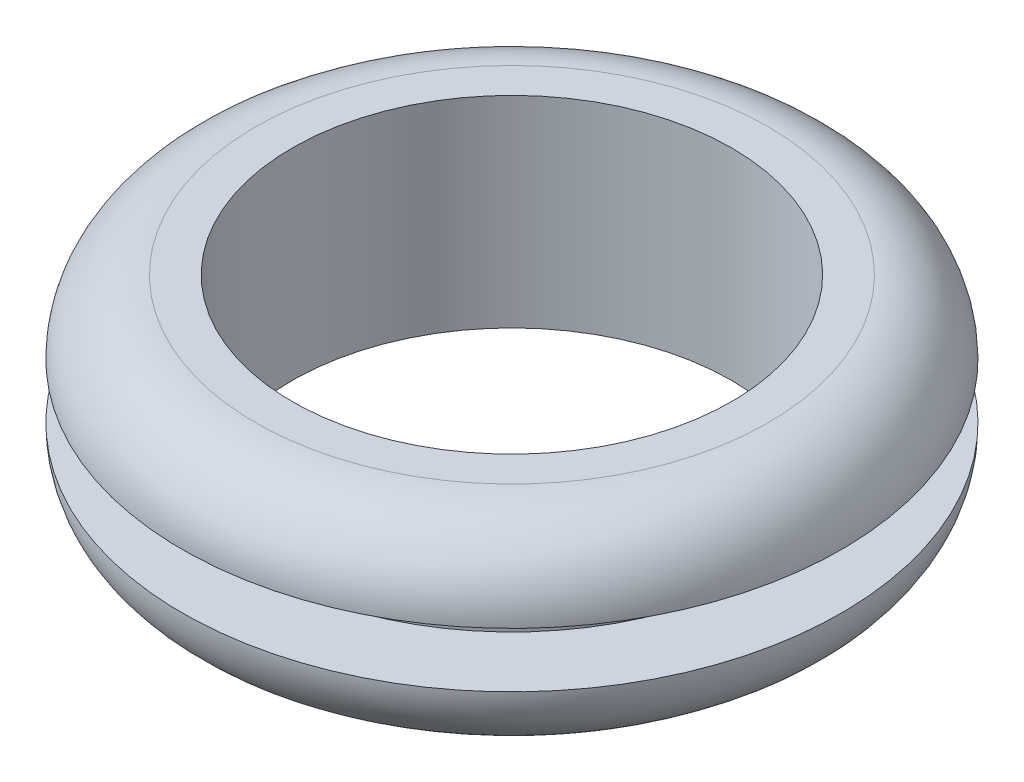
ISO-10303-21;
HEADER;
FILE_DESCRIPTION(('STEP AP214'),'2;1');
FILE_NAME('part.step','',(''),(''),'','','');
FILE_SCHEMA(('AUTOMOTIVE_DESIGN { 1 0 10303 214 1 1 1 1 }'));
ENDSEC;
DATA;
#1=APPLICATION_CONTEXT('core data for automotive mechanical design processes');
#2=APPLICATION_PROTOCOL_DEFINITION('international standard','automotive_design',2000,#1);
#3=PRODUCT_CONTEXT('',#1,'mechanical');
#4=PRODUCT('Part','Part','',(#3));
#5=PRODUCT_RELATED_PRODUCT_CATEGORY('part','',(#4));
#6=PRODUCT_DEFINITION_FORMATION('','',#4);
#7=PRODUCT_DEFINITION_CONTEXT('part definition',#1,'design');
#8=PRODUCT_DEFINITION('design','',#6,#7);
#9=PRODUCT_DEFINITION_SHAPE('','',#8);
#10=(LENGTH_UNIT() NAMED_UNIT(*) SI_UNIT(.MILLI.,.METRE.));
#11=(NAMED_UNIT(*) PLANE_ANGLE_UNIT() SI_UNIT($,.RADIAN.));
#12=(NAMED_UNIT(*) SI_UNIT($,.STERADIAN.) SOLID_ANGLE_UNIT());
#13=UNCERTAINTY_MEASURE_WITH_UNIT(LENGTH_MEASURE(1.E-05),#10,'distance_accuracy_value','');
#14=(GEOMETRIC_REPRESENTATION_CONTEXT(3) GLOBAL_UNCERTAINTY_ASSIGNED_CONTEXT((#13)) GLOBAL_UNIT_ASSIGNED_CONTEXT((#10,
#11,#12)) REPRESENTATION_CONTEXT('',''));
#15=CARTESIAN_POINT('',(0.,0.,0.));
#16=DIRECTION('',(0.,0.,1.));
#17=DIRECTION('',(1.,0.,0.));
#18=AXIS2_PLACEMENT_3D('',#15,#16,#17);
#19=CARTESIAN_POINT('',(0.,-4.365625,9.525));
#20=DIRECTION('',(0.,1.,0.));
#21=DIRECTION('',(0.,0.,1.));
#22=AXIS2_PLACEMENT_3D('',#19,#20,#21);
#23=PLANE('',#22);
#24=CARTESIAN_POINT('',(0.,-4.365625,0.));
#25=DIRECTION('',(0.,-1.,0.));
#26=DIRECTION('',(0.,0.,-1.));
#27=AXIS2_PLACEMENT_3D('',#24,#25,#26);
#28=CIRCLE('',#27,9.525);
#29=CARTESIAN_POINT('',(0.,-4.365625,-9.525));
#30=VERTEX_POINT('',#29);
#31=EDGE_CURVE('E10',#30,#30,#28,.T.);
#32=ORIENTED_EDGE('',*,*,#31,.F.);
#33=EDGE_LOOP('',(#32));
#34=FACE_BOUND('',#33,.T.);
#35=CARTESIAN_POINT('',(0.,-4.365625,0.));
#36=DIRECTION('',(0.,-1.,0.));
#37=DIRECTION('',(0.,0.,-1.));
#38=AXIS2_PLACEMENT_3D('',#35,#36,#37);
#39=CIRCLE('',#38,11.1125);
#40=CARTESIAN_POINT('',(0.,-4.365625,-11.1125));
#41=VERTEX_POINT('',#40);
#42=EDGE_CURVE('E58',#41,#41,#39,.T.);
#43=ORIENTED_EDGE('',*,*,#42,.T.);
#44=EDGE_LOOP('',(#43));
#45=FACE_BOUND('',#44,.T.);
#46=ADVANCED_FACE('F30',(#34,#45),#23,.F.);
#47=CARTESIAN_POINT('',(0.,-4.365625,0.));
#48=DIRECTION('',(0.,-1.,0.));
#49=DIRECTION('',(0.,0.,-1.));
#50=AXIS2_PLACEMENT_3D('',#47,#48,#49);
#51=CYLINDRICAL_SURFACE('',#50,9.525);
#52=CARTESIAN_POINT('',(0.,4.365625,0.));
#53=DIRECTION('',(0.,-1.,0.));
#54=DIRECTION('',(0.,0.,-1.));
#55=AXIS2_PLACEMENT_3D('',#52,#53,#54);
#56=CIRCLE('',#55,9.525);
#57=CARTESIAN_POINT('',(0.,4.365625,-9.525));
#58=VERTEX_POINT('',#57);
#59=EDGE_CURVE('E36',#58,#58,#56,.T.);
#60=ORIENTED_EDGE('',*,*,#59,.F.);
#61=EDGE_LOOP('',(#60));
#62=FACE_BOUND('',#61,.T.);
#63=ORIENTED_EDGE('',*,*,#31,.T.);
#64=EDGE_LOOP('',(#63));
#65=FACE_BOUND('',#64,.T.);
#66=ADVANCED_FACE('F95',(#62,#65),#51,.F.);
#67=CARTESIAN_POINT('',(0.,4.365625,9.525));
#68=DIRECTION('',(0.,-1.,0.));
#69=DIRECTION('',(0.,0.,-1.));
#70=AXIS2_PLACEMENT_3D('',#67,#68,#69);
#71=PLANE('',#70);
#72=CARTESIAN_POINT('',(0.,4.365625,0.));
#73=DIRECTION('',(0.,-1.,0.));
#74=DIRECTION('',(0.,0.,-1.));
#75=AXIS2_PLACEMENT_3D('',#72,#73,#74);
#76=CIRCLE('',#75,11.1125);
#77=CARTESIAN_POINT('',(0.,4.365625,-11.1125));
#78=VERTEX_POINT('',#77);
#79=EDGE_CURVE('E40',#78,#78,#76,.T.);
#80=ORIENTED_EDGE('',*,*,#79,.F.);
#81=EDGE_LOOP('',(#80));
#82=FACE_BOUND('',#81,.T.);
#83=ORIENTED_EDGE('',*,*,#59,.T.);
#84=EDGE_LOOP('',(#83));
#85=FACE_BOUND('',#84,.T.);
#86=ADVANCED_FACE('F90',(#82,#85),#71,.F.);
#87=CARTESIAN_POINT('',(0.,1.190625,0.));
#88=DIRECTION('',(0.,-1.,0.));
#89=DIRECTION('',(0.,0.,-1.));
#90=AXIS2_PLACEMENT_3D('',#87,#88,#89);
#91=TOROIDAL_SURFACE('',#90,11.1125,3.175);
#92=CARTESIAN_POINT('',(0.,1.190625,0.));
#93=DIRECTION('',(0.,-1.,0.));
#94=DIRECTION('',(0.,0.,-1.));
#95=AXIS2_PLACEMENT_3D('',#92,#93,#94);
#96=CIRCLE('',#95,14.2875);
#97=CARTESIAN_POINT('',(0.,1.190625,-14.2875));
#98=VERTEX_POINT('',#97);
#99=EDGE_CURVE('E44',#98,#98,#96,.T.);
#100=ORIENTED_EDGE('',*,*,#99,.F.);
#101=EDGE_LOOP('',(#100));
#102=FACE_BOUND('',#101,.T.);
#103=ORIENTED_EDGE('',*,*,#79,.T.);
#104=EDGE_LOOP('',(#103));
#105=FACE_BOUND('',#104,.T.);
#106=ADVANCED_FACE('F84',(#102,#105),#91,.T.);
#107=CARTESIAN_POINT('',(0.,1.190625,11.1125));
#108=DIRECTION('',(0.,1.,0.));
#109=DIRECTION('',(0.,0.,1.));
#110=AXIS2_PLACEMENT_3D('',#107,#108,#109);
#111=PLANE('',#110);
#112=CARTESIAN_POINT('',(0.,1.190625,0.));
#113=DIRECTION('',(0.,-1.,0.));
#114=DIRECTION('',(0.,0.,-1.));
#115=AXIS2_PLACEMENT_3D('',#112,#113,#114);
#116=CIRCLE('',#115,11.1125);
#117=CARTESIAN_POINT('',(0.,1.190625,-11.1125));
#118=VERTEX_POINT('',#117);
#119=EDGE_CURVE('E49',#118,#118,#116,.T.);
#120=ORIENTED_EDGE('',*,*,#119,.F.);
#121=EDGE_LOOP('',(#120));
#122=FACE_BOUND('',#121,.T.);
#123=ORIENTED_EDGE('',*,*,#99,.T.);
#124=EDGE_LOOP('',(#123));
#125=FACE_BOUND('',#124,.T.);
#126=ADVANCED_FACE('F78',(#122,#125),#111,.F.);
#127=CARTESIAN_POINT('',(0.,-4.365625,0.));
#128=DIRECTION('',(0.,-1.,0.));
#129=DIRECTION('',(0.,0.,-1.));
#130=AXIS2_PLACEMENT_3D('',#127,#128,#129);
#131=CYLINDRICAL_SURFACE('',#130,11.1125);
#132=CARTESIAN_POINT('',(0.,-1.190625,0.));
#133=DIRECTION('',(0.,-1.,0.));
#134=DIRECTION('',(0.,0.,-1.));
#135=AXIS2_PLACEMENT_3D('',#132,#133,#134);
#136=CIRCLE('',#135,11.1125);
#137=CARTESIAN_POINT('',(0.,-1.190625,-11.1125));
#138=VERTEX_POINT('',#137);
#139=EDGE_CURVE('E52',#138,#138,#136,.T.);
#140=ORIENTED_EDGE('',*,*,#139,.F.);
#141=EDGE_LOOP('',(#140));
#142=FACE_BOUND('',#141,.T.);
#143=ORIENTED_EDGE('',*,*,#119,.T.);
#144=EDGE_LOOP('',(#143));
#145=FACE_BOUND('',#144,.T.);
#146=ADVANCED_FACE('F72',(#142,#145),#131,.T.);
#147=CARTESIAN_POINT('',(0.,-1.190625,11.1125));
#148=DIRECTION('',(0.,-1.,0.));
#149=DIRECTION('',(0.,0.,-1.));
#150=AXIS2_PLACEMENT_3D('',#147,#148,#149);
#151=PLANE('',#150);
#152=CARTESIAN_POINT('',(0.,-1.190625,0.));
#153=DIRECTION('',(0.,-1.,0.));
#154=DIRECTION('',(0.,0.,-1.));
#155=AXIS2_PLACEMENT_3D('',#152,#153,#154);
#156=CIRCLE('',#155,14.2875);
#157=CARTESIAN_POINT('',(0.,-1.190625,-14.2875));
#158=VERTEX_POINT('',#157);
#159=EDGE_CURVE('E55',#158,#158,#156,.T.);
#160=ORIENTED_EDGE('',*,*,#159,.F.);
#161=EDGE_LOOP('',(#160));
#162=FACE_BOUND('',#161,.T.);
#163=ORIENTED_EDGE('',*,*,#139,.T.);
#164=EDGE_LOOP('',(#163));
#165=FACE_BOUND('',#164,.T.);
#166=ADVANCED_FACE('F66',(#162,#165),#151,.F.);
#167=CARTESIAN_POINT('',(0.,-1.190625,0.));
#168=DIRECTION('',(0.,-1.,0.));
#169=DIRECTION('',(0.,0.,-1.));
#170=AXIS2_PLACEMENT_3D('',#167,#168,#169);
#171=TOROIDAL_SURFACE('',#170,11.1125,3.175);
#172=ORIENTED_EDGE('',*,*,#42,.F.);
#173=EDGE_LOOP('',(#172));
#174=FACE_BOUND('',#173,.T.);
#175=ORIENTED_EDGE('',*,*,#159,.T.);
#176=EDGE_LOOP('',(#175));
#177=FACE_BOUND('',#176,.T.);
#178=ADVANCED_FACE('F63',(#174,#177),#171,.T.);
#179=CLOSED_SHELL('',(#46,#66,#86,#106,#126,#146,#166,#178));
#180=MANIFOLD_SOLID_BREP('B2',#179);
#181=ADVANCED_BREP_SHAPE_REPRESENTATION('',(#18,#180),#14);
#182=SHAPE_DEFINITION_REPRESENTATION(#9,#181);
ENDSEC;
END-ISO-10303-21;
